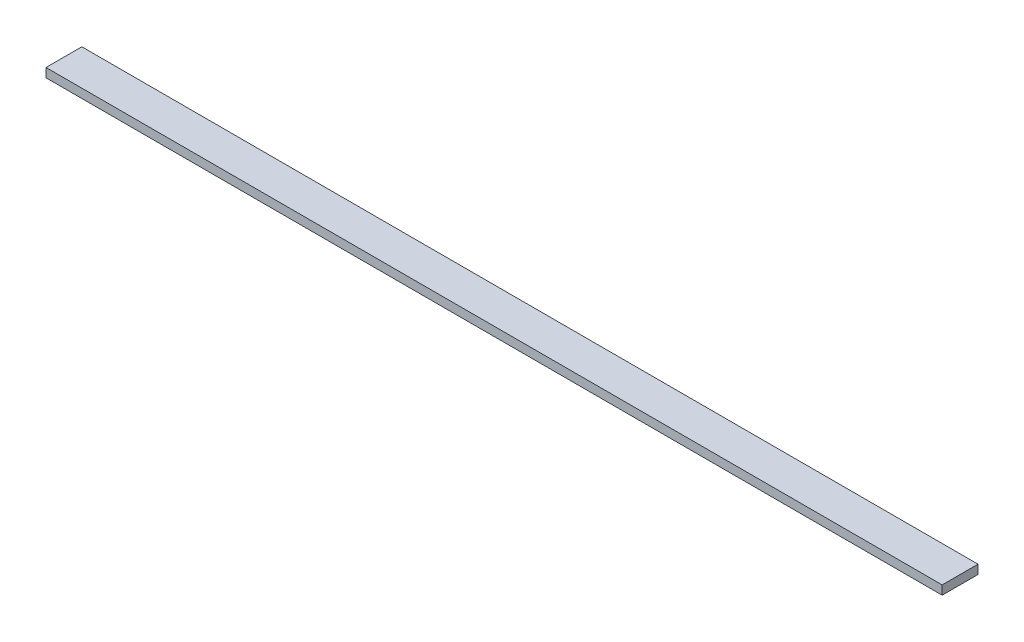
ISO-10303-21;
HEADER;
FILE_DESCRIPTION(('STEP AP214'),'2;1');
FILE_NAME('part.step','',(''),(''),'','','');
FILE_SCHEMA(('AUTOMOTIVE_DESIGN { 1 0 10303 214 1 1 1 1 }'));
ENDSEC;
DATA;
#1=APPLICATION_CONTEXT('core data for automotive mechanical design processes');
#2=APPLICATION_PROTOCOL_DEFINITION('international standard','automotive_design',2000,#1);
#3=PRODUCT_CONTEXT('',#1,'mechanical');
#4=PRODUCT('Part','Part','',(#3));
#5=PRODUCT_RELATED_PRODUCT_CATEGORY('part','',(#4));
#6=PRODUCT_DEFINITION_FORMATION('','',#4);
#7=PRODUCT_DEFINITION_CONTEXT('part definition',#1,'design');
#8=PRODUCT_DEFINITION('design','',#6,#7);
#9=PRODUCT_DEFINITION_SHAPE('','',#8);
#10=(LENGTH_UNIT() NAMED_UNIT(*) SI_UNIT(.MILLI.,.METRE.));
#11=(NAMED_UNIT(*) PLANE_ANGLE_UNIT() SI_UNIT($,.RADIAN.));
#12=(NAMED_UNIT(*) SI_UNIT($,.STERADIAN.) SOLID_ANGLE_UNIT());
#13=UNCERTAINTY_MEASURE_WITH_UNIT(LENGTH_MEASURE(1.E-05),#10,'distance_accuracy_value','');
#14=(GEOMETRIC_REPRESENTATION_CONTEXT(3) GLOBAL_UNCERTAINTY_ASSIGNED_CONTEXT((#13)) GLOBAL_UNIT_ASSIGNED_CONTEXT((#10,
#11,#12)) REPRESENTATION_CONTEXT('',''));
#15=CARTESIAN_POINT('',(0.,0.,0.));
#16=DIRECTION('',(0.,0.,1.));
#17=DIRECTION('',(1.,0.,0.));
#18=AXIS2_PLACEMENT_3D('',#15,#16,#17);
#19=CARTESIAN_POINT('',(250.,5.,-10.));
#20=DIRECTION('',(-1.,0.,0.));
#21=DIRECTION('',(0.,0.,1.));
#22=AXIS2_PLACEMENT_3D('',#19,#20,#21);
#23=PLANE('',#22);
#24=DIRECTION('',(0.,0.,-1.));
#25=VECTOR('',#24,1.);
#26=CARTESIAN_POINT('',(250.,0.,-10.));
#27=LINE('',#26,#25);
#28=CARTESIAN_POINT('',(250.,0.,10.));
#29=VERTEX_POINT('',#28);
#30=CARTESIAN_POINT('',(250.,0.,-10.));
#31=VERTEX_POINT('',#30);
#32=EDGE_CURVE('E107',#29,#31,#27,.T.);
#33=ORIENTED_EDGE('',*,*,#32,.T.);
#34=DIRECTION('',(0.,-1.,0.));
#35=VECTOR('',#34,1.);
#36=CARTESIAN_POINT('',(250.,5.,-10.));
#37=LINE('',#36,#35);
#38=CARTESIAN_POINT('',(250.,5.,-10.));
#39=VERTEX_POINT('',#38);
#40=EDGE_CURVE('E11',#39,#31,#37,.T.);
#41=ORIENTED_EDGE('',*,*,#40,.F.);
#42=DIRECTION('',(0.,0.,-1.));
#43=VECTOR('',#42,1.);
#44=CARTESIAN_POINT('',(250.,5.,-10.));
#45=LINE('',#44,#43);
#46=CARTESIAN_POINT('',(250.,5.,10.));
#47=VERTEX_POINT('',#46);
#48=EDGE_CURVE('E91',#47,#39,#45,.T.);
#49=ORIENTED_EDGE('',*,*,#48,.F.);
#50=DIRECTION('',(0.,-1.,0.));
#51=VECTOR('',#50,1.);
#52=CARTESIAN_POINT('',(250.,5.,10.));
#53=LINE('',#52,#51);
#54=EDGE_CURVE('E103',#47,#29,#53,.T.);
#55=ORIENTED_EDGE('',*,*,#54,.T.);
#56=EDGE_LOOP('',(#33,#41,#49,#55));
#57=FACE_BOUND('',#56,.T.);
#58=ADVANCED_FACE('F39',(#57),#23,.F.);
#59=CARTESIAN_POINT('',(-250.,5.,-10.));
#60=DIRECTION('',(0.,0.,1.));
#61=DIRECTION('',(1.,0.,0.));
#62=AXIS2_PLACEMENT_3D('',#59,#60,#61);
#63=PLANE('',#62);
#64=DIRECTION('',(-1.,0.,0.));
#65=VECTOR('',#64,1.);
#66=CARTESIAN_POINT('',(-250.,0.,-10.));
#67=LINE('',#66,#65);
#68=CARTESIAN_POINT('',(-250.,0.,-10.));
#69=VERTEX_POINT('',#68);
#70=EDGE_CURVE('E96',#31,#69,#67,.T.);
#71=ORIENTED_EDGE('',*,*,#70,.T.);
#72=DIRECTION('',(0.,-1.,0.));
#73=VECTOR('',#72,1.);
#74=CARTESIAN_POINT('',(-250.,5.,-10.));
#75=LINE('',#74,#73);
#76=CARTESIAN_POINT('',(-250.,5.,-10.));
#77=VERTEX_POINT('',#76);
#78=EDGE_CURVE('E48',#77,#69,#75,.T.);
#79=ORIENTED_EDGE('',*,*,#78,.F.);
#80=DIRECTION('',(-1.,0.,0.));
#81=VECTOR('',#80,1.);
#82=CARTESIAN_POINT('',(-250.,5.,-10.));
#83=LINE('',#82,#81);
#84=EDGE_CURVE('E86',#39,#77,#83,.T.);
#85=ORIENTED_EDGE('',*,*,#84,.F.);
#86=ORIENTED_EDGE('',*,*,#40,.T.);
#87=EDGE_LOOP('',(#71,#79,#85,#86));
#88=FACE_BOUND('',#87,.T.);
#89=ADVANCED_FACE('F95',(#88),#63,.F.);
#90=CARTESIAN_POINT('',(-250.,5.,-10.));
#91=DIRECTION('',(1.,0.,0.));
#92=DIRECTION('',(0.,0.,-1.));
#93=AXIS2_PLACEMENT_3D('',#90,#91,#92);
#94=PLANE('',#93);
#95=DIRECTION('',(0.,0.,1.));
#96=VECTOR('',#95,1.);
#97=CARTESIAN_POINT('',(-250.,0.,-10.));
#98=LINE('',#97,#96);
#99=CARTESIAN_POINT('',(-250.,0.,10.));
#100=VERTEX_POINT('',#99);
#101=EDGE_CURVE('E73',#69,#100,#98,.T.);
#102=ORIENTED_EDGE('',*,*,#101,.T.);
#103=DIRECTION('',(0.,-1.,0.));
#104=VECTOR('',#103,1.);
#105=CARTESIAN_POINT('',(-250.,5.,10.));
#106=LINE('',#105,#104);
#107=CARTESIAN_POINT('',(-250.,5.,10.));
#108=VERTEX_POINT('',#107);
#109=EDGE_CURVE('E98',#108,#100,#106,.T.);
#110=ORIENTED_EDGE('',*,*,#109,.F.);
#111=DIRECTION('',(0.,0.,1.));
#112=VECTOR('',#111,1.);
#113=CARTESIAN_POINT('',(-250.,5.,-10.));
#114=LINE('',#113,#112);
#115=EDGE_CURVE('E89',#77,#108,#114,.T.);
#116=ORIENTED_EDGE('',*,*,#115,.F.);
#117=ORIENTED_EDGE('',*,*,#78,.T.);
#118=EDGE_LOOP('',(#102,#110,#116,#117));
#119=FACE_BOUND('',#118,.T.);
#120=ADVANCED_FACE('F99',(#119),#94,.F.);
#121=CARTESIAN_POINT('',(-250.,5.,10.));
#122=DIRECTION('',(0.,0.,-1.));
#123=DIRECTION('',(-1.,0.,0.));
#124=AXIS2_PLACEMENT_3D('',#121,#122,#123);
#125=PLANE('',#124);
#126=DIRECTION('',(1.,0.,0.));
#127=VECTOR('',#126,1.);
#128=CARTESIAN_POINT('',(-250.,0.,10.));
#129=LINE('',#128,#127);
#130=EDGE_CURVE('E79',#100,#29,#129,.T.);
#131=ORIENTED_EDGE('',*,*,#130,.T.);
#132=ORIENTED_EDGE('',*,*,#54,.F.);
#133=DIRECTION('',(1.,0.,0.));
#134=VECTOR('',#133,1.);
#135=CARTESIAN_POINT('',(-250.,5.,10.));
#136=LINE('',#135,#134);
#137=EDGE_CURVE('E56',#108,#47,#136,.T.);
#138=ORIENTED_EDGE('',*,*,#137,.F.);
#139=ORIENTED_EDGE('',*,*,#109,.T.);
#140=EDGE_LOOP('',(#131,#132,#138,#139));
#141=FACE_BOUND('',#140,.T.);
#142=ADVANCED_FACE('F120',(#141),#125,.F.);
#143=CARTESIAN_POINT('',(0.,5.,0.));
#144=DIRECTION('',(0.,1.,0.));
#145=DIRECTION('',(0.,0.,1.));
#146=AXIS2_PLACEMENT_3D('',#143,#144,#145);
#147=PLANE('',#146);
#148=ORIENTED_EDGE('',*,*,#48,.T.);
#149=ORIENTED_EDGE('',*,*,#84,.T.);
#150=ORIENTED_EDGE('',*,*,#115,.T.);
#151=ORIENTED_EDGE('',*,*,#137,.T.);
#152=EDGE_LOOP('',(#148,#149,#150,#151));
#153=FACE_BOUND('',#152,.T.);
#154=ADVANCED_FACE('F87',(#153),#147,.T.);
#155=CARTESIAN_POINT('',(0.,0.,0.));
#156=DIRECTION('',(0.,1.,0.));
#157=DIRECTION('',(0.,0.,1.));
#158=AXIS2_PLACEMENT_3D('',#155,#156,#157);
#159=PLANE('',#158);
#160=ORIENTED_EDGE('',*,*,#32,.F.);
#161=ORIENTED_EDGE('',*,*,#130,.F.);
#162=ORIENTED_EDGE('',*,*,#101,.F.);
#163=ORIENTED_EDGE('',*,*,#70,.F.);
#164=EDGE_LOOP('',(#160,#161,#162,#163));
#165=FACE_BOUND('',#164,.T.);
#166=ADVANCED_FACE('F123',(#165),#159,.F.);
#167=CLOSED_SHELL('',(#58,#89,#120,#142,#154,#166));
#168=MANIFOLD_SOLID_BREP('B2',#167);
#169=ADVANCED_BREP_SHAPE_REPRESENTATION('',(#18,#168),#14);
#170=SHAPE_DEFINITION_REPRESENTATION(#9,#169);
ENDSEC;
END-ISO-10303-21;
